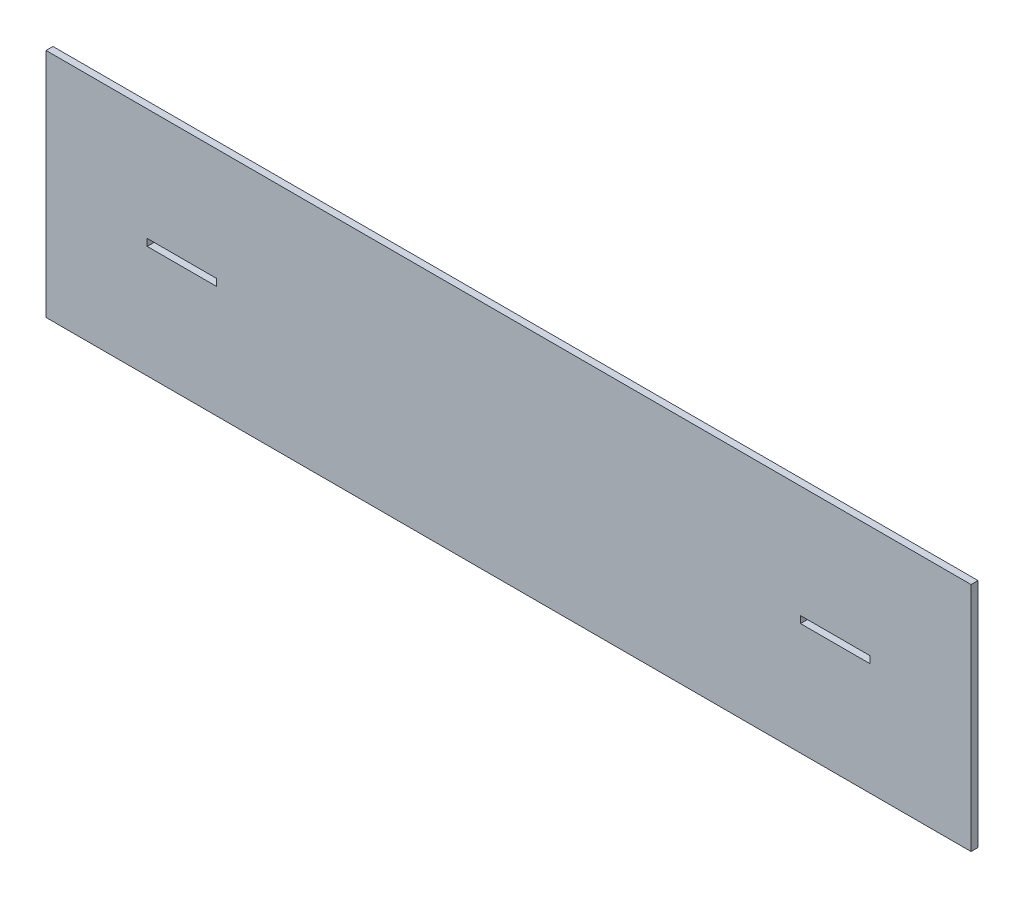
ISO-10303-21;
HEADER;
FILE_DESCRIPTION(('STEP AP214'),'2;1');
FILE_NAME('part.step','',(''),(''),'','','');
FILE_SCHEMA(('AUTOMOTIVE_DESIGN { 1 0 10303 214 1 1 1 1 }'));
ENDSEC;
DATA;
#1=APPLICATION_CONTEXT('core data for automotive mechanical design processes');
#2=APPLICATION_PROTOCOL_DEFINITION('international standard','automotive_design',2000,#1);
#3=PRODUCT_CONTEXT('',#1,'mechanical');
#4=PRODUCT('Part','Part','',(#3));
#5=PRODUCT_RELATED_PRODUCT_CATEGORY('part','',(#4));
#6=PRODUCT_DEFINITION_FORMATION('','',#4);
#7=PRODUCT_DEFINITION_CONTEXT('part definition',#1,'design');
#8=PRODUCT_DEFINITION('design','',#6,#7);
#9=PRODUCT_DEFINITION_SHAPE('','',#8);
#10=(LENGTH_UNIT() NAMED_UNIT(*) SI_UNIT(.MILLI.,.METRE.));
#11=(NAMED_UNIT(*) PLANE_ANGLE_UNIT() SI_UNIT($,.RADIAN.));
#12=(NAMED_UNIT(*) SI_UNIT($,.STERADIAN.) SOLID_ANGLE_UNIT());
#13=UNCERTAINTY_MEASURE_WITH_UNIT(LENGTH_MEASURE(1.E-05),#10,'distance_accuracy_value','');
#14=(GEOMETRIC_REPRESENTATION_CONTEXT(3) GLOBAL_UNCERTAINTY_ASSIGNED_CONTEXT((#13)) GLOBAL_UNIT_ASSIGNED_CONTEXT((#10,
#11,#12)) REPRESENTATION_CONTEXT('',''));
#15=CARTESIAN_POINT('',(0.,0.,0.));
#16=DIRECTION('',(0.,0.,1.));
#17=DIRECTION('',(1.,0.,0.));
#18=AXIS2_PLACEMENT_3D('',#15,#16,#17);
#19=CARTESIAN_POINT('',(0.,0.,3.));
#20=DIRECTION('',(0.,0.,1.));
#21=DIRECTION('',(1.,0.,0.));
#22=AXIS2_PLACEMENT_3D('',#19,#20,#21);
#23=PLANE('',#22);
#24=DIRECTION('',(0.,1.,0.));
#25=VECTOR('',#24,1.);
#26=CARTESIAN_POINT('',(200.,50.,3.));
#27=LINE('',#26,#25);
#28=CARTESIAN_POINT('',(200.,-50.,3.));
#29=VERTEX_POINT('',#28);
#30=CARTESIAN_POINT('',(200.,50.,3.));
#31=VERTEX_POINT('',#30);
#32=EDGE_CURVE('E228',#29,#31,#27,.T.);
#33=ORIENTED_EDGE('',*,*,#32,.T.);
#34=DIRECTION('',(-1.,0.,0.));
#35=VECTOR('',#34,1.);
#36=CARTESIAN_POINT('',(-200.,50.,3.));
#37=LINE('',#36,#35);
#38=CARTESIAN_POINT('',(-200.,50.,3.));
#39=VERTEX_POINT('',#38);
#40=EDGE_CURVE('E232',#31,#39,#37,.T.);
#41=ORIENTED_EDGE('',*,*,#40,.T.);
#42=DIRECTION('',(0.,-1.,0.));
#43=VECTOR('',#42,1.);
#44=CARTESIAN_POINT('',(-200.,50.,3.));
#45=LINE('',#44,#43);
#46=CARTESIAN_POINT('',(-200.,-50.,3.));
#47=VERTEX_POINT('',#46);
#48=EDGE_CURVE('E236',#39,#47,#45,.T.);
#49=ORIENTED_EDGE('',*,*,#48,.T.);
#50=DIRECTION('',(1.,0.,0.));
#51=VECTOR('',#50,1.);
#52=CARTESIAN_POINT('',(-200.,-50.,3.));
#53=LINE('',#52,#51);
#54=EDGE_CURVE('E239',#47,#29,#53,.T.);
#55=ORIENTED_EDGE('',*,*,#54,.T.);
#56=EDGE_LOOP('',(#33,#41,#49,#55));
#57=FACE_BOUND('',#56,.T.);
#58=DIRECTION('',(-1.,0.,0.));
#59=VECTOR('',#58,1.);
#60=CARTESIAN_POINT('',(-156.24,1.49999999999997,3.));
#61=LINE('',#60,#59);
#62=CARTESIAN_POINT('',(-126.24,1.49999999999996,3.));
#63=VERTEX_POINT('',#62);
#64=CARTESIAN_POINT('',(-156.24,1.49999999999997,3.));
#65=VERTEX_POINT('',#64);
#66=EDGE_CURVE('E188',#63,#65,#61,.T.);
#67=ORIENTED_EDGE('',*,*,#66,.F.);
#68=DIRECTION('',(0.,1.,0.));
#69=VECTOR('',#68,1.);
#70=CARTESIAN_POINT('',(-126.24,1.49999999999996,3.));
#71=LINE('',#70,#69);
#72=CARTESIAN_POINT('',(-126.24,-1.50000000000003,3.));
#73=VERTEX_POINT('',#72);
#74=EDGE_CURVE('E185',#73,#63,#71,.T.);
#75=ORIENTED_EDGE('',*,*,#74,.F.);
#76=DIRECTION('',(1.,0.,0.));
#77=VECTOR('',#76,1.);
#78=CARTESIAN_POINT('',(-156.24,-1.50000000000003,3.));
#79=LINE('',#78,#77);
#80=CARTESIAN_POINT('',(-156.24,-1.50000000000003,3.));
#81=VERTEX_POINT('',#80);
#82=EDGE_CURVE('E196',#81,#73,#79,.T.);
#83=ORIENTED_EDGE('',*,*,#82,.F.);
#84=DIRECTION('',(0.,-1.,0.));
#85=VECTOR('',#84,1.);
#86=CARTESIAN_POINT('',(-156.24,1.49999999999997,3.));
#87=LINE('',#86,#85);
#88=EDGE_CURVE('E192',#65,#81,#87,.T.);
#89=ORIENTED_EDGE('',*,*,#88,.F.);
#90=EDGE_LOOP('',(#67,#75,#83,#89));
#91=FACE_BOUND('',#90,.T.);
#92=DIRECTION('',(0.,-1.,0.));
#93=VECTOR('',#92,1.);
#94=CARTESIAN_POINT('',(126.24,1.49999999999999,3.));
#95=LINE('',#94,#93);
#96=CARTESIAN_POINT('',(126.24,1.49999999999999,3.));
#97=VERTEX_POINT('',#96);
#98=CARTESIAN_POINT('',(126.24,-1.5,3.));
#99=VERTEX_POINT('',#98);
#100=EDGE_CURVE('E146',#97,#99,#95,.T.);
#101=ORIENTED_EDGE('',*,*,#100,.F.);
#102=DIRECTION('',(-1.,0.,0.));
#103=VECTOR('',#102,1.);
#104=CARTESIAN_POINT('',(156.24,1.5,3.));
#105=LINE('',#104,#103);
#106=CARTESIAN_POINT('',(156.24,1.5,3.));
#107=VERTEX_POINT('',#106);
#108=EDGE_CURVE('E137',#107,#97,#105,.T.);
#109=ORIENTED_EDGE('',*,*,#108,.F.);
#110=DIRECTION('',(0.,1.,0.));
#111=VECTOR('',#110,1.);
#112=CARTESIAN_POINT('',(156.24,1.5,3.));
#113=LINE('',#112,#111);
#114=CARTESIAN_POINT('',(156.24,-1.49999999999999,3.));
#115=VERTEX_POINT('',#114);
#116=EDGE_CURVE('E163',#115,#107,#113,.T.);
#117=ORIENTED_EDGE('',*,*,#116,.F.);
#118=DIRECTION('',(1.,0.,0.));
#119=VECTOR('',#118,1.);
#120=CARTESIAN_POINT('',(156.24,-1.49999999999999,3.));
#121=LINE('',#120,#119);
#122=EDGE_CURVE('E159',#99,#115,#121,.T.);
#123=ORIENTED_EDGE('',*,*,#122,.F.);
#124=EDGE_LOOP('',(#101,#109,#117,#123));
#125=FACE_BOUND('',#124,.T.);
#126=ADVANCED_FACE('F47',(#57,#91,#125),#23,.T.);
#127=CARTESIAN_POINT('',(0.,0.,0.));
#128=DIRECTION('',(0.,0.,1.));
#129=DIRECTION('',(1.,0.,0.));
#130=AXIS2_PLACEMENT_3D('',#127,#128,#129);
#131=PLANE('',#130);
#132=DIRECTION('',(0.,1.,0.));
#133=VECTOR('',#132,1.);
#134=CARTESIAN_POINT('',(-126.24,1.49999999999996,0.));
#135=LINE('',#134,#133);
#136=CARTESIAN_POINT('',(-126.24,-1.50000000000003,0.));
#137=VERTEX_POINT('',#136);
#138=CARTESIAN_POINT('',(-126.24,1.49999999999996,0.));
#139=VERTEX_POINT('',#138);
#140=EDGE_CURVE('E155',#137,#139,#135,.T.);
#141=ORIENTED_EDGE('',*,*,#140,.T.);
#142=DIRECTION('',(-1.,0.,0.));
#143=VECTOR('',#142,1.);
#144=CARTESIAN_POINT('',(-156.24,1.49999999999997,0.));
#145=LINE('',#144,#143);
#146=CARTESIAN_POINT('',(-156.24,1.49999999999997,0.));
#147=VERTEX_POINT('',#146);
#148=EDGE_CURVE('E203',#139,#147,#145,.T.);
#149=ORIENTED_EDGE('',*,*,#148,.T.);
#150=DIRECTION('',(0.,-1.,0.));
#151=VECTOR('',#150,1.);
#152=CARTESIAN_POINT('',(-156.24,1.49999999999997,0.));
#153=LINE('',#152,#151);
#154=CARTESIAN_POINT('',(-156.24,-1.50000000000003,0.));
#155=VERTEX_POINT('',#154);
#156=EDGE_CURVE('E207',#147,#155,#153,.T.);
#157=ORIENTED_EDGE('',*,*,#156,.T.);
#158=DIRECTION('',(1.,0.,0.));
#159=VECTOR('',#158,1.);
#160=CARTESIAN_POINT('',(-156.24,-1.50000000000003,0.));
#161=LINE('',#160,#159);
#162=EDGE_CURVE('E189',#155,#137,#161,.T.);
#163=ORIENTED_EDGE('',*,*,#162,.T.);
#164=EDGE_LOOP('',(#141,#149,#157,#163));
#165=FACE_BOUND('',#164,.T.);
#166=DIRECTION('',(0.,1.,0.));
#167=VECTOR('',#166,1.);
#168=CARTESIAN_POINT('',(200.,50.,0.));
#169=LINE('',#168,#167);
#170=CARTESIAN_POINT('',(200.,-50.,0.));
#171=VERTEX_POINT('',#170);
#172=CARTESIAN_POINT('',(200.,50.,0.));
#173=VERTEX_POINT('',#172);
#174=EDGE_CURVE('E227',#171,#173,#169,.T.);
#175=ORIENTED_EDGE('',*,*,#174,.F.);
#176=DIRECTION('',(1.,0.,0.));
#177=VECTOR('',#176,1.);
#178=CARTESIAN_POINT('',(-200.,-50.,0.));
#179=LINE('',#178,#177);
#180=CARTESIAN_POINT('',(-200.,-50.,0.));
#181=VERTEX_POINT('',#180);
#182=EDGE_CURVE('E233',#181,#171,#179,.T.);
#183=ORIENTED_EDGE('',*,*,#182,.F.);
#184=DIRECTION('',(0.,-1.,0.));
#185=VECTOR('',#184,1.);
#186=CARTESIAN_POINT('',(-200.,50.,0.));
#187=LINE('',#186,#185);
#188=CARTESIAN_POINT('',(-200.,50.,0.));
#189=VERTEX_POINT('',#188);
#190=EDGE_CURVE('E249',#189,#181,#187,.T.);
#191=ORIENTED_EDGE('',*,*,#190,.F.);
#192=DIRECTION('',(-1.,0.,0.));
#193=VECTOR('',#192,1.);
#194=CARTESIAN_POINT('',(-200.,50.,0.));
#195=LINE('',#194,#193);
#196=EDGE_CURVE('E246',#173,#189,#195,.T.);
#197=ORIENTED_EDGE('',*,*,#196,.F.);
#198=EDGE_LOOP('',(#175,#183,#191,#197));
#199=FACE_BOUND('',#198,.T.);
#200=DIRECTION('',(-1.,0.,0.));
#201=VECTOR('',#200,1.);
#202=CARTESIAN_POINT('',(156.24,1.5,0.));
#203=LINE('',#202,#201);
#204=CARTESIAN_POINT('',(156.24,1.5,0.));
#205=VERTEX_POINT('',#204);
#206=CARTESIAN_POINT('',(126.24,1.49999999999999,0.));
#207=VERTEX_POINT('',#206);
#208=EDGE_CURVE('E71',#205,#207,#203,.T.);
#209=ORIENTED_EDGE('',*,*,#208,.T.);
#210=DIRECTION('',(0.,-1.,0.));
#211=VECTOR('',#210,1.);
#212=CARTESIAN_POINT('',(126.24,1.49999999999999,0.));
#213=LINE('',#212,#211);
#214=CARTESIAN_POINT('',(126.24,-1.5,0.));
#215=VERTEX_POINT('',#214);
#216=EDGE_CURVE('E153',#207,#215,#213,.T.);
#217=ORIENTED_EDGE('',*,*,#216,.T.);
#218=DIRECTION('',(1.,0.,0.));
#219=VECTOR('',#218,1.);
#220=CARTESIAN_POINT('',(156.24,-1.49999999999999,0.));
#221=LINE('',#220,#219);
#222=CARTESIAN_POINT('',(156.24,-1.49999999999999,0.));
#223=VERTEX_POINT('',#222);
#224=EDGE_CURVE('E172',#215,#223,#221,.T.);
#225=ORIENTED_EDGE('',*,*,#224,.T.);
#226=DIRECTION('',(0.,1.,0.));
#227=VECTOR('',#226,1.);
#228=CARTESIAN_POINT('',(156.24,1.5,0.));
#229=LINE('',#228,#227);
#230=EDGE_CURVE('E147',#223,#205,#229,.T.);
#231=ORIENTED_EDGE('',*,*,#230,.T.);
#232=EDGE_LOOP('',(#209,#217,#225,#231));
#233=FACE_BOUND('',#232,.T.);
#234=ADVANCED_FACE('F272',(#165,#199,#233),#131,.F.);
#235=CARTESIAN_POINT('',(200.,50.,3.));
#236=DIRECTION('',(-1.,0.,0.));
#237=DIRECTION('',(0.,-1.,0.));
#238=AXIS2_PLACEMENT_3D('',#235,#236,#237);
#239=PLANE('',#238);
#240=ORIENTED_EDGE('',*,*,#174,.T.);
#241=DIRECTION('',(0.,0.,-1.));
#242=VECTOR('',#241,1.);
#243=CARTESIAN_POINT('',(200.,50.,3.));
#244=LINE('',#243,#242);
#245=EDGE_CURVE('E11',#31,#173,#244,.T.);
#246=ORIENTED_EDGE('',*,*,#245,.F.);
#247=ORIENTED_EDGE('',*,*,#32,.F.);
#248=DIRECTION('',(0.,0.,-1.));
#249=VECTOR('',#248,1.);
#250=CARTESIAN_POINT('',(200.,-50.,3.));
#251=LINE('',#250,#249);
#252=EDGE_CURVE('E242',#29,#171,#251,.T.);
#253=ORIENTED_EDGE('',*,*,#252,.T.);
#254=EDGE_LOOP('',(#240,#246,#247,#253));
#255=FACE_BOUND('',#254,.T.);
#256=ADVANCED_FACE('F49',(#255),#239,.F.);
#257=CARTESIAN_POINT('',(-200.,50.,3.));
#258=DIRECTION('',(0.,-1.,0.));
#259=DIRECTION('',(1.,0.,0.));
#260=AXIS2_PLACEMENT_3D('',#257,#258,#259);
#261=PLANE('',#260);
#262=ORIENTED_EDGE('',*,*,#196,.T.);
#263=DIRECTION('',(0.,0.,-1.));
#264=VECTOR('',#263,1.);
#265=CARTESIAN_POINT('',(-200.,50.,3.));
#266=LINE('',#265,#264);
#267=EDGE_CURVE('E56',#39,#189,#266,.T.);
#268=ORIENTED_EDGE('',*,*,#267,.F.);
#269=ORIENTED_EDGE('',*,*,#40,.F.);
#270=ORIENTED_EDGE('',*,*,#245,.T.);
#271=EDGE_LOOP('',(#262,#268,#269,#270));
#272=FACE_BOUND('',#271,.T.);
#273=ADVANCED_FACE('F283',(#272),#261,.F.);
#274=CARTESIAN_POINT('',(-200.,50.,3.));
#275=DIRECTION('',(1.,0.,0.));
#276=DIRECTION('',(0.,1.,0.));
#277=AXIS2_PLACEMENT_3D('',#274,#275,#276);
#278=PLANE('',#277);
#279=ORIENTED_EDGE('',*,*,#190,.T.);
#280=DIRECTION('',(0.,0.,-1.));
#281=VECTOR('',#280,1.);
#282=CARTESIAN_POINT('',(-200.,-50.,3.));
#283=LINE('',#282,#281);
#284=EDGE_CURVE('E257',#47,#181,#283,.T.);
#285=ORIENTED_EDGE('',*,*,#284,.F.);
#286=ORIENTED_EDGE('',*,*,#48,.F.);
#287=ORIENTED_EDGE('',*,*,#267,.T.);
#288=EDGE_LOOP('',(#279,#285,#286,#287));
#289=FACE_BOUND('',#288,.T.);
#290=ADVANCED_FACE('F266',(#289),#278,.F.);
#291=CARTESIAN_POINT('',(-200.,-50.,3.));
#292=DIRECTION('',(0.,1.,0.));
#293=DIRECTION('',(-1.,0.,0.));
#294=AXIS2_PLACEMENT_3D('',#291,#292,#293);
#295=PLANE('',#294);
#296=ORIENTED_EDGE('',*,*,#182,.T.);
#297=ORIENTED_EDGE('',*,*,#252,.F.);
#298=ORIENTED_EDGE('',*,*,#54,.F.);
#299=ORIENTED_EDGE('',*,*,#284,.T.);
#300=EDGE_LOOP('',(#296,#297,#298,#299));
#301=FACE_BOUND('',#300,.T.);
#302=ADVANCED_FACE('F276',(#301),#295,.F.);
#303=CARTESIAN_POINT('',(-126.24,1.49999999999996,3.));
#304=DIRECTION('',(-1.,0.,0.));
#305=DIRECTION('',(0.,0.,1.));
#306=AXIS2_PLACEMENT_3D('',#303,#304,#305);
#307=PLANE('',#306);
#308=ORIENTED_EDGE('',*,*,#140,.F.);
#309=DIRECTION('',(0.,0.,-1.));
#310=VECTOR('',#309,1.);
#311=CARTESIAN_POINT('',(-126.24,-1.50000000000003,3.));
#312=LINE('',#311,#310);
#313=EDGE_CURVE('E199',#73,#137,#312,.T.);
#314=ORIENTED_EDGE('',*,*,#313,.F.);
#315=ORIENTED_EDGE('',*,*,#74,.T.);
#316=DIRECTION('',(0.,0.,-1.));
#317=VECTOR('',#316,1.);
#318=CARTESIAN_POINT('',(-126.24,1.49999999999996,3.));
#319=LINE('',#318,#317);
#320=EDGE_CURVE('E223',#63,#139,#319,.T.);
#321=ORIENTED_EDGE('',*,*,#320,.T.);
#322=EDGE_LOOP('',(#308,#314,#315,#321));
#323=FACE_BOUND('',#322,.T.);
#324=ADVANCED_FACE('F298',(#323),#307,.T.);
#325=CARTESIAN_POINT('',(-156.24,1.49999999999997,3.));
#326=DIRECTION('',(0.,-1.,0.));
#327=DIRECTION('',(1.,0.,0.));
#328=AXIS2_PLACEMENT_3D('',#325,#326,#327);
#329=PLANE('',#328);
#330=ORIENTED_EDGE('',*,*,#148,.F.);
#331=ORIENTED_EDGE('',*,*,#320,.F.);
#332=ORIENTED_EDGE('',*,*,#66,.T.);
#333=DIRECTION('',(0.,0.,-1.));
#334=VECTOR('',#333,1.);
#335=CARTESIAN_POINT('',(-156.24,1.49999999999997,3.));
#336=LINE('',#335,#334);
#337=EDGE_CURVE('E220',#65,#147,#336,.T.);
#338=ORIENTED_EDGE('',*,*,#337,.T.);
#339=EDGE_LOOP('',(#330,#331,#332,#338));
#340=FACE_BOUND('',#339,.T.);
#341=ADVANCED_FACE('F305',(#340),#329,.T.);
#342=CARTESIAN_POINT('',(-156.24,1.49999999999997,3.));
#343=DIRECTION('',(1.,0.,0.));
#344=DIRECTION('',(0.,1.,0.));
#345=AXIS2_PLACEMENT_3D('',#342,#343,#344);
#346=PLANE('',#345);
#347=ORIENTED_EDGE('',*,*,#156,.F.);
#348=ORIENTED_EDGE('',*,*,#337,.F.);
#349=ORIENTED_EDGE('',*,*,#88,.T.);
#350=DIRECTION('',(0.,0.,-1.));
#351=VECTOR('',#350,1.);
#352=CARTESIAN_POINT('',(-156.24,-1.50000000000003,3.));
#353=LINE('',#352,#351);
#354=EDGE_CURVE('E217',#81,#155,#353,.T.);
#355=ORIENTED_EDGE('',*,*,#354,.T.);
#356=EDGE_LOOP('',(#347,#348,#349,#355));
#357=FACE_BOUND('',#356,.T.);
#358=ADVANCED_FACE('F310',(#357),#346,.T.);
#359=CARTESIAN_POINT('',(-156.24,-1.50000000000003,3.));
#360=DIRECTION('',(0.,1.,0.));
#361=DIRECTION('',(0.,0.,1.));
#362=AXIS2_PLACEMENT_3D('',#359,#360,#361);
#363=PLANE('',#362);
#364=ORIENTED_EDGE('',*,*,#162,.F.);
#365=ORIENTED_EDGE('',*,*,#354,.F.);
#366=ORIENTED_EDGE('',*,*,#82,.T.);
#367=ORIENTED_EDGE('',*,*,#313,.T.);
#368=EDGE_LOOP('',(#364,#365,#366,#367));
#369=FACE_BOUND('',#368,.T.);
#370=ADVANCED_FACE('F317',(#369),#363,.T.);
#371=CARTESIAN_POINT('',(156.24,1.5,3.));
#372=DIRECTION('',(0.,-1.,0.));
#373=DIRECTION('',(1.,0.,0.));
#374=AXIS2_PLACEMENT_3D('',#371,#372,#373);
#375=PLANE('',#374);
#376=ORIENTED_EDGE('',*,*,#208,.F.);
#377=DIRECTION('',(0.,0.,-1.));
#378=VECTOR('',#377,1.);
#379=CARTESIAN_POINT('',(156.24,1.5,3.));
#380=LINE('',#379,#378);
#381=EDGE_CURVE('E141',#107,#205,#380,.T.);
#382=ORIENTED_EDGE('',*,*,#381,.F.);
#383=ORIENTED_EDGE('',*,*,#108,.T.);
#384=DIRECTION('',(0.,0.,-1.));
#385=VECTOR('',#384,1.);
#386=CARTESIAN_POINT('',(126.24,1.49999999999999,3.));
#387=LINE('',#386,#385);
#388=EDGE_CURVE('E140',#97,#207,#387,.T.);
#389=ORIENTED_EDGE('',*,*,#388,.T.);
#390=EDGE_LOOP('',(#376,#382,#383,#389));
#391=FACE_BOUND('',#390,.T.);
#392=ADVANCED_FACE('F139',(#391),#375,.T.);
#393=CARTESIAN_POINT('',(126.24,1.49999999999999,3.));
#394=DIRECTION('',(1.,0.,0.));
#395=DIRECTION('',(0.,0.,-1.));
#396=AXIS2_PLACEMENT_3D('',#393,#394,#395);
#397=PLANE('',#396);
#398=ORIENTED_EDGE('',*,*,#216,.F.);
#399=ORIENTED_EDGE('',*,*,#388,.F.);
#400=ORIENTED_EDGE('',*,*,#100,.T.);
#401=DIRECTION('',(0.,0.,-1.));
#402=VECTOR('',#401,1.);
#403=CARTESIAN_POINT('',(126.24,-1.5,3.));
#404=LINE('',#403,#402);
#405=EDGE_CURVE('E156',#99,#215,#404,.T.);
#406=ORIENTED_EDGE('',*,*,#405,.T.);
#407=EDGE_LOOP('',(#398,#399,#400,#406));
#408=FACE_BOUND('',#407,.T.);
#409=ADVANCED_FACE('F150',(#408),#397,.T.);
#410=CARTESIAN_POINT('',(156.24,-1.49999999999999,3.));
#411=DIRECTION('',(0.,1.,0.));
#412=DIRECTION('',(-1.,0.,0.));
#413=AXIS2_PLACEMENT_3D('',#410,#411,#412);
#414=PLANE('',#413);
#415=ORIENTED_EDGE('',*,*,#224,.F.);
#416=ORIENTED_EDGE('',*,*,#405,.F.);
#417=ORIENTED_EDGE('',*,*,#122,.T.);
#418=DIRECTION('',(0.,0.,-1.));
#419=VECTOR('',#418,1.);
#420=CARTESIAN_POINT('',(156.24,-1.49999999999999,3.));
#421=LINE('',#420,#419);
#422=EDGE_CURVE('E63',#115,#223,#421,.T.);
#423=ORIENTED_EDGE('',*,*,#422,.T.);
#424=EDGE_LOOP('',(#415,#416,#417,#423));
#425=FACE_BOUND('',#424,.T.);
#426=ADVANCED_FACE('F335',(#425),#414,.T.);
#427=CARTESIAN_POINT('',(156.24,1.5,3.));
#428=DIRECTION('',(-1.,0.,0.));
#429=DIRECTION('',(0.,-1.,0.));
#430=AXIS2_PLACEMENT_3D('',#427,#428,#429);
#431=PLANE('',#430);
#432=ORIENTED_EDGE('',*,*,#230,.F.);
#433=ORIENTED_EDGE('',*,*,#422,.F.);
#434=ORIENTED_EDGE('',*,*,#116,.T.);
#435=ORIENTED_EDGE('',*,*,#381,.T.);
#436=EDGE_LOOP('',(#432,#433,#434,#435));
#437=FACE_BOUND('',#436,.T.);
#438=ADVANCED_FACE('F338',(#437),#431,.T.);
#439=CLOSED_SHELL('',(#126,#234,#256,#273,#290,#302,#324,#341,#358,#370,#392,#409,#426,#438));
#440=MANIFOLD_SOLID_BREP('B2',#439);
#441=ADVANCED_BREP_SHAPE_REPRESENTATION('',(#18,#440),#14);
#442=SHAPE_DEFINITION_REPRESENTATION(#9,#441);
ENDSEC;
END-ISO-10303-21;
